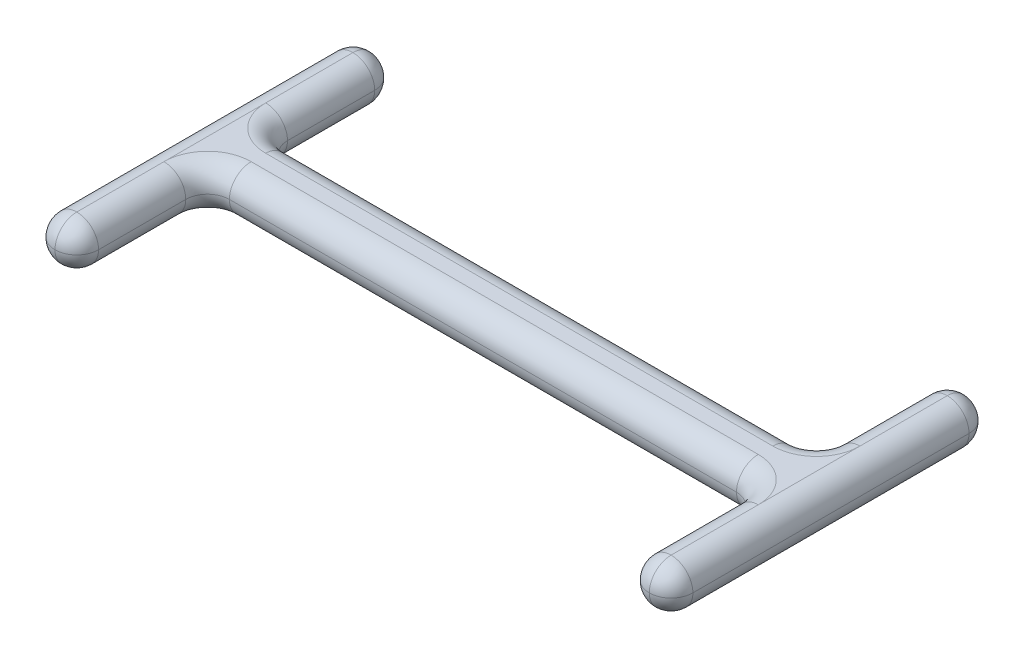
ISO-10303-21;
HEADER;
FILE_DESCRIPTION(('STEP AP214'),'2;1');
FILE_NAME('part.step','',(''),(''),'','','');
FILE_SCHEMA(('AUTOMOTIVE_DESIGN { 1 0 10303 214 1 1 1 1 }'));
ENDSEC;
DATA;
#1=APPLICATION_CONTEXT('core data for automotive mechanical design processes');
#2=APPLICATION_PROTOCOL_DEFINITION('international standard','automotive_design',2000,#1);
#3=PRODUCT_CONTEXT('',#1,'mechanical');
#4=PRODUCT('Part','Part','',(#3));
#5=PRODUCT_RELATED_PRODUCT_CATEGORY('part','',(#4));
#6=PRODUCT_DEFINITION_FORMATION('','',#4);
#7=PRODUCT_DEFINITION_CONTEXT('part definition',#1,'design');
#8=PRODUCT_DEFINITION('design','',#6,#7);
#9=PRODUCT_DEFINITION_SHAPE('','',#8);
#10=(LENGTH_UNIT() NAMED_UNIT(*) SI_UNIT(.MILLI.,.METRE.));
#11=(NAMED_UNIT(*) PLANE_ANGLE_UNIT() SI_UNIT($,.RADIAN.));
#12=(NAMED_UNIT(*) SI_UNIT($,.STERADIAN.) SOLID_ANGLE_UNIT());
#13=UNCERTAINTY_MEASURE_WITH_UNIT(LENGTH_MEASURE(1.E-05),#10,'distance_accuracy_value','');
#14=(GEOMETRIC_REPRESENTATION_CONTEXT(3) GLOBAL_UNCERTAINTY_ASSIGNED_CONTEXT((#13)) GLOBAL_UNIT_ASSIGNED_CONTEXT((#10,
#11,#12)) REPRESENTATION_CONTEXT('',''));
#15=CARTESIAN_POINT('',(0.,0.,0.));
#16=DIRECTION('',(0.,0.,1.));
#17=DIRECTION('',(1.,0.,0.));
#18=AXIS2_PLACEMENT_3D('',#15,#16,#17);
#19=CARTESIAN_POINT('',(0.,0.,0.));
#20=DIRECTION('',(0.,1.,0.));
#21=DIRECTION('',(0.,0.,1.));
#22=AXIS2_PLACEMENT_3D('',#19,#20,#21);
#23=PLANE('',#22);
#24=CARTESIAN_POINT('',(-43.615,0.,8.75000000000001));
#25=DIRECTION('',(0.,1.,0.));
#26=DIRECTION('',(0.,0.,1.));
#27=AXIS2_PLACEMENT_3D('',#24,#25,#26);
#28=CIRCLE('',#27,7.5);
#29=CARTESIAN_POINT('',(-51.115,0.,8.75000000000001));
#30=VERTEX_POINT('',#29);
#31=CARTESIAN_POINT('',(-43.615,0.,1.25000000000001));
#32=VERTEX_POINT('',#31);
#33=EDGE_CURVE('E214',#30,#32,#28,.F.);
#34=ORIENTED_EDGE('',*,*,#33,.F.);
#35=DIRECTION('',(0.,0.,1.));
#36=VECTOR('',#35,1.);
#37=CARTESIAN_POINT('',(-51.115,0.,0.));
#38=LINE('',#37,#36);
#39=CARTESIAN_POINT('',(-51.115,0.,-8.74999999999998));
#40=VERTEX_POINT('',#39);
#41=EDGE_CURVE('E360',#30,#40,#38,.F.);
#42=ORIENTED_EDGE('',*,*,#41,.T.);
#43=CARTESIAN_POINT('',(-43.615,0.,-8.74999999999998));
#44=DIRECTION('',(0.,1.,0.));
#45=DIRECTION('',(0.,0.,1.));
#46=AXIS2_PLACEMENT_3D('',#43,#44,#45);
#47=CIRCLE('',#46,7.5);
#48=CARTESIAN_POINT('',(-43.615,0.,-1.24999999999998));
#49=VERTEX_POINT('',#48);
#50=EDGE_CURVE('E364',#49,#40,#47,.F.);
#51=ORIENTED_EDGE('',*,*,#50,.F.);
#52=DIRECTION('',(-1.,0.,0.));
#53=VECTOR('',#52,1.);
#54=CARTESIAN_POINT('',(0.,0.,-1.24999999999999));
#55=LINE('',#54,#53);
#56=CARTESIAN_POINT('',(43.615,0.,-1.24999999999999));
#57=VERTEX_POINT('',#56);
#58=EDGE_CURVE('E372',#49,#57,#55,.F.);
#59=ORIENTED_EDGE('',*,*,#58,.T.);
#60=CARTESIAN_POINT('',(43.615,0.,-8.74999999999999));
#61=DIRECTION('',(0.,1.,0.));
#62=DIRECTION('',(0.,0.,1.));
#63=AXIS2_PLACEMENT_3D('',#60,#61,#62);
#64=CIRCLE('',#63,7.5);
#65=CARTESIAN_POINT('',(51.115,0.,-8.74999999999999));
#66=VERTEX_POINT('',#65);
#67=EDGE_CURVE('E376',#66,#57,#64,.F.);
#68=ORIENTED_EDGE('',*,*,#67,.F.);
#69=DIRECTION('',(0.,0.,-1.));
#70=VECTOR('',#69,1.);
#71=CARTESIAN_POINT('',(51.115,0.,0.));
#72=LINE('',#71,#70);
#73=CARTESIAN_POINT('',(51.115,0.,8.75000000000001));
#74=VERTEX_POINT('',#73);
#75=EDGE_CURVE('E384',#66,#74,#72,.F.);
#76=ORIENTED_EDGE('',*,*,#75,.T.);
#77=CARTESIAN_POINT('',(43.615,0.,8.75000000000001));
#78=DIRECTION('',(0.,1.,0.));
#79=DIRECTION('',(0.,0.,1.));
#80=AXIS2_PLACEMENT_3D('',#77,#78,#79);
#81=CIRCLE('',#80,7.5);
#82=CARTESIAN_POINT('',(43.615,0.,1.25000000000001));
#83=VERTEX_POINT('',#82);
#84=EDGE_CURVE('E380',#83,#74,#81,.F.);
#85=ORIENTED_EDGE('',*,*,#84,.F.);
#86=DIRECTION('',(1.,0.,0.));
#87=VECTOR('',#86,1.);
#88=CARTESIAN_POINT('',(0.,0.,1.25000000000001));
#89=LINE('',#88,#87);
#90=EDGE_CURVE('E368',#83,#32,#89,.F.);
#91=ORIENTED_EDGE('',*,*,#90,.T.);
#92=EDGE_LOOP('',(#34,#42,#51,#59,#68,#76,#85,#91));
#93=FACE_BOUND('',#92,.T.);
#94=ADVANCED_FACE('F43',(#93),#23,.F.);
#95=CARTESIAN_POINT('',(0.,7.5,0.));
#96=DIRECTION('',(0.,1.,0.));
#97=DIRECTION('',(0.,0.,1.));
#98=AXIS2_PLACEMENT_3D('',#95,#96,#97);
#99=PLANE('',#98);
#100=CARTESIAN_POINT('',(-43.615,7.5,-8.74999999999998));
#101=DIRECTION('',(0.,1.,0.));
#102=DIRECTION('',(0.,0.,1.));
#103=AXIS2_PLACEMENT_3D('',#100,#101,#102);
#104=CIRCLE('',#103,7.5);
#105=CARTESIAN_POINT('',(-51.115,7.5,-8.74999999999998));
#106=VERTEX_POINT('',#105);
#107=CARTESIAN_POINT('',(-43.615,7.5,-1.24999999999998));
#108=VERTEX_POINT('',#107);
#109=EDGE_CURVE('E392',#106,#108,#104,.T.);
#110=ORIENTED_EDGE('',*,*,#109,.F.);
#111=DIRECTION('',(0.,0.,1.));
#112=VECTOR('',#111,1.);
#113=CARTESIAN_POINT('',(-51.115,7.5,27.5));
#114=LINE('',#113,#112);
#115=CARTESIAN_POINT('',(-51.115,7.5,8.75000000000001));
#116=VERTEX_POINT('',#115);
#117=EDGE_CURVE('E388',#106,#116,#114,.T.);
#118=ORIENTED_EDGE('',*,*,#117,.T.);
#119=CARTESIAN_POINT('',(-43.615,7.5,8.75000000000001));
#120=DIRECTION('',(0.,1.,0.));
#121=DIRECTION('',(0.,0.,1.));
#122=AXIS2_PLACEMENT_3D('',#119,#120,#121);
#123=CIRCLE('',#122,7.5);
#124=CARTESIAN_POINT('',(-43.615,7.5,1.25000000000001));
#125=VERTEX_POINT('',#124);
#126=EDGE_CURVE('E396',#125,#116,#123,.T.);
#127=ORIENTED_EDGE('',*,*,#126,.F.);
#128=DIRECTION('',(1.,0.,0.));
#129=VECTOR('',#128,1.);
#130=CARTESIAN_POINT('',(47.365,7.5,1.25000000000001));
#131=LINE('',#130,#129);
#132=CARTESIAN_POINT('',(43.615,7.5,1.25000000000001));
#133=VERTEX_POINT('',#132);
#134=EDGE_CURVE('E400',#125,#133,#131,.T.);
#135=ORIENTED_EDGE('',*,*,#134,.T.);
#136=CARTESIAN_POINT('',(43.615,7.5,8.75000000000001));
#137=DIRECTION('',(0.,1.,0.));
#138=DIRECTION('',(0.,0.,1.));
#139=AXIS2_PLACEMENT_3D('',#136,#137,#138);
#140=CIRCLE('',#139,7.5);
#141=CARTESIAN_POINT('',(51.115,7.5,8.75000000000001));
#142=VERTEX_POINT('',#141);
#143=EDGE_CURVE('E404',#142,#133,#140,.T.);
#144=ORIENTED_EDGE('',*,*,#143,.F.);
#145=DIRECTION('',(0.,0.,-1.));
#146=VECTOR('',#145,1.);
#147=CARTESIAN_POINT('',(51.115,7.5,-27.5));
#148=LINE('',#147,#146);
#149=CARTESIAN_POINT('',(51.115,7.5,-8.74999999999999));
#150=VERTEX_POINT('',#149);
#151=EDGE_CURVE('E219',#142,#150,#148,.T.);
#152=ORIENTED_EDGE('',*,*,#151,.T.);
#153=CARTESIAN_POINT('',(43.615,7.5,-8.74999999999999));
#154=DIRECTION('',(0.,1.,0.));
#155=DIRECTION('',(0.,0.,1.));
#156=AXIS2_PLACEMENT_3D('',#153,#154,#155);
#157=CIRCLE('',#156,7.5);
#158=CARTESIAN_POINT('',(43.615,7.5,-1.24999999999999));
#159=VERTEX_POINT('',#158);
#160=EDGE_CURVE('E412',#159,#150,#157,.T.);
#161=ORIENTED_EDGE('',*,*,#160,.F.);
#162=DIRECTION('',(-1.,0.,0.));
#163=VECTOR('',#162,1.);
#164=CARTESIAN_POINT('',(-47.365,7.5,-1.24999999999998));
#165=LINE('',#164,#163);
#166=EDGE_CURVE('E408',#159,#108,#165,.T.);
#167=ORIENTED_EDGE('',*,*,#166,.T.);
#168=EDGE_LOOP('',(#110,#118,#127,#135,#144,#152,#161,#167));
#169=FACE_BOUND('',#168,.T.);
#170=ADVANCED_FACE('F424',(#169),#99,.T.);
#171=CARTESIAN_POINT('',(-47.365,3.75,-1.24999999999998));
#172=DIRECTION('',(-1.,0.,0.));
#173=DIRECTION('',(0.,0.,1.));
#174=AXIS2_PLACEMENT_3D('',#171,#172,#173);
#175=CYLINDRICAL_SURFACE('',#174,3.75);
#176=CARTESIAN_POINT('',(43.615,3.75,-1.24999999999999));
#177=DIRECTION('',(1.,0.,0.));
#178=DIRECTION('',(0.,0.,-1.));
#179=AXIS2_PLACEMENT_3D('',#176,#177,#178);
#180=CIRCLE('',#179,3.75);
#181=CARTESIAN_POINT('',(43.615,3.75,-4.99999999999999));
#182=VERTEX_POINT('',#181);
#183=EDGE_CURVE('E228',#57,#182,#180,.T.);
#184=ORIENTED_EDGE('',*,*,#183,.F.);
#185=ORIENTED_EDGE('',*,*,#58,.F.);
#186=CARTESIAN_POINT('',(-43.615,3.75,-1.24999999999998));
#187=DIRECTION('',(-1.,0.,0.));
#188=DIRECTION('',(0.,0.,1.));
#189=AXIS2_PLACEMENT_3D('',#186,#187,#188);
#190=CIRCLE('',#189,3.75);
#191=CARTESIAN_POINT('',(-43.615,3.75,-4.99999999999998));
#192=VERTEX_POINT('',#191);
#193=EDGE_CURVE('E215',#192,#49,#190,.T.);
#194=ORIENTED_EDGE('',*,*,#193,.F.);
#195=DIRECTION('',(-1.,0.,0.));
#196=VECTOR('',#195,1.);
#197=CARTESIAN_POINT('',(-47.365,3.75,-4.99999999999998));
#198=LINE('',#197,#196);
#199=EDGE_CURVE('E224',#182,#192,#198,.T.);
#200=ORIENTED_EDGE('',*,*,#199,.F.);
#201=EDGE_LOOP('',(#184,#185,#194,#200));
#202=FACE_BOUND('',#201,.T.);
#203=ADVANCED_FACE('F591',(#202),#175,.T.);
#204=CARTESIAN_POINT('',(-43.615,3.75,-8.74999999999998));
#205=DIRECTION('',(0.,1.,0.));
#206=DIRECTION('',(0.,0.,1.));
#207=AXIS2_PLACEMENT_3D('',#204,#205,#206);
#208=TOROIDAL_SURFACE('',#207,7.5,3.75);
#209=CARTESIAN_POINT('',(-43.615,3.75,-8.74999999999998));
#210=DIRECTION('',(0.,1.,0.));
#211=DIRECTION('',(0.,0.,1.));
#212=AXIS2_PLACEMENT_3D('',#209,#210,#211);
#213=CIRCLE('',#212,3.75);
#214=CARTESIAN_POINT('',(-47.365,3.75,-8.74999999999998));
#215=VERTEX_POINT('',#214);
#216=EDGE_CURVE('E220',#192,#215,#213,.F.);
#217=ORIENTED_EDGE('',*,*,#216,.F.);
#218=ORIENTED_EDGE('',*,*,#193,.T.);
#219=ORIENTED_EDGE('',*,*,#50,.T.);
#220=CARTESIAN_POINT('',(-51.115,3.75,-8.74999999999998));
#221=DIRECTION('',(0.,0.,1.));
#222=DIRECTION('',(1.,0.,0.));
#223=AXIS2_PLACEMENT_3D('',#220,#221,#222);
#224=CIRCLE('',#223,3.75);
#225=EDGE_CURVE('E232',#215,#40,#224,.F.);
#226=ORIENTED_EDGE('',*,*,#225,.F.);
#227=EDGE_LOOP('',(#217,#218,#219,#226));
#228=FACE_BOUND('',#227,.T.);
#229=ADVANCED_FACE('F596',(#228),#208,.T.);
#230=CARTESIAN_POINT('',(0.,3.75,-1.24999999999999));
#231=DIRECTION('',(1.,0.,0.));
#232=DIRECTION('',(0.,0.,-1.));
#233=AXIS2_PLACEMENT_3D('',#230,#231,#232);
#234=CYLINDRICAL_SURFACE('',#233,3.75);
#235=CARTESIAN_POINT('',(43.615,3.75,-1.24999999999999));
#236=DIRECTION('',(1.,0.,0.));
#237=DIRECTION('',(0.,0.,-1.));
#238=AXIS2_PLACEMENT_3D('',#235,#236,#237);
#239=CIRCLE('',#238,3.75);
#240=EDGE_CURVE('E240',#182,#159,#239,.T.);
#241=ORIENTED_EDGE('',*,*,#240,.F.);
#242=ORIENTED_EDGE('',*,*,#199,.T.);
#243=CARTESIAN_POINT('',(-43.615,3.75,-1.24999999999998));
#244=DIRECTION('',(-1.,0.,0.));
#245=DIRECTION('',(0.,0.,1.));
#246=AXIS2_PLACEMENT_3D('',#243,#244,#245);
#247=CIRCLE('',#246,3.75);
#248=EDGE_CURVE('E236',#108,#192,#247,.T.);
#249=ORIENTED_EDGE('',*,*,#248,.F.);
#250=ORIENTED_EDGE('',*,*,#166,.F.);
#251=EDGE_LOOP('',(#241,#242,#249,#250));
#252=FACE_BOUND('',#251,.T.);
#253=ADVANCED_FACE('F588',(#252),#234,.T.);
#254=CARTESIAN_POINT('',(43.615,3.75,-8.74999999999999));
#255=DIRECTION('',(0.,1.,0.));
#256=DIRECTION('',(0.,0.,1.));
#257=AXIS2_PLACEMENT_3D('',#254,#255,#256);
#258=TOROIDAL_SURFACE('',#257,7.5,3.75);
#259=ORIENTED_EDGE('',*,*,#183,.T.);
#260=CARTESIAN_POINT('',(43.615,3.75,-8.74999999999999));
#261=DIRECTION('',(0.,1.,0.));
#262=DIRECTION('',(0.,0.,1.));
#263=AXIS2_PLACEMENT_3D('',#260,#261,#262);
#264=CIRCLE('',#263,3.75);
#265=CARTESIAN_POINT('',(47.365,3.75,-8.74999999999999));
#266=VERTEX_POINT('',#265);
#267=EDGE_CURVE('E244',#266,#182,#264,.F.);
#268=ORIENTED_EDGE('',*,*,#267,.F.);
#269=CARTESIAN_POINT('',(51.115,3.75,-8.74999999999999));
#270=DIRECTION('',(0.,0.,1.));
#271=DIRECTION('',(1.,0.,0.));
#272=AXIS2_PLACEMENT_3D('',#269,#270,#271);
#273=CIRCLE('',#272,3.75);
#274=EDGE_CURVE('E248',#66,#266,#273,.F.);
#275=ORIENTED_EDGE('',*,*,#274,.F.);
#276=ORIENTED_EDGE('',*,*,#67,.T.);
#277=EDGE_LOOP('',(#259,#268,#275,#276));
#278=FACE_BOUND('',#277,.T.);
#279=ADVANCED_FACE('F594',(#278),#258,.T.);
#280=CARTESIAN_POINT('',(-51.115,3.75,-27.5));
#281=DIRECTION('',(0.,0.,-1.));
#282=DIRECTION('',(-1.,0.,0.));
#283=AXIS2_PLACEMENT_3D('',#280,#281,#282);
#284=CYLINDRICAL_SURFACE('',#283,3.75);
#285=DIRECTION('',(0.,0.,-1.));
#286=VECTOR('',#285,1.);
#287=CARTESIAN_POINT('',(-51.115,0.,0.));
#288=LINE('',#287,#286);
#289=CARTESIAN_POINT('',(-51.115,0.,-23.75));
#290=VERTEX_POINT('',#289);
#291=EDGE_CURVE('E252',#290,#40,#288,.F.);
#292=ORIENTED_EDGE('',*,*,#291,.F.);
#293=CARTESIAN_POINT('',(-51.115,3.75,-23.75));
#294=DIRECTION('',(0.,0.,-1.));
#295=DIRECTION('',(-1.,0.,0.));
#296=AXIS2_PLACEMENT_3D('',#293,#294,#295);
#297=CIRCLE('',#296,3.75);
#298=CARTESIAN_POINT('',(-47.365,3.75,-23.75));
#299=VERTEX_POINT('',#298);
#300=EDGE_CURVE('E206',#290,#299,#297,.F.);
#301=ORIENTED_EDGE('',*,*,#300,.T.);
#302=DIRECTION('',(0.,0.,-1.));
#303=VECTOR('',#302,1.);
#304=CARTESIAN_POINT('',(-47.365,3.75,-27.5));
#305=LINE('',#304,#303);
#306=EDGE_CURVE('E256',#215,#299,#305,.T.);
#307=ORIENTED_EDGE('',*,*,#306,.F.);
#308=ORIENTED_EDGE('',*,*,#225,.T.);
#309=EDGE_LOOP('',(#292,#301,#307,#308));
#310=FACE_BOUND('',#309,.T.);
#311=ADVANCED_FACE('F566',(#310),#284,.T.);
#312=CARTESIAN_POINT('',(-43.615,3.75,-8.74999999999998));
#313=DIRECTION('',(0.,1.,0.));
#314=DIRECTION('',(0.,0.,1.));
#315=AXIS2_PLACEMENT_3D('',#312,#313,#314);
#316=TOROIDAL_SURFACE('',#315,7.5,3.75);
#317=ORIENTED_EDGE('',*,*,#248,.T.);
#318=ORIENTED_EDGE('',*,*,#216,.T.);
#319=CARTESIAN_POINT('',(-51.115,3.75,-8.74999999999998));
#320=DIRECTION('',(0.,0.,1.));
#321=DIRECTION('',(1.,0.,0.));
#322=AXIS2_PLACEMENT_3D('',#319,#320,#321);
#323=CIRCLE('',#322,3.75);
#324=EDGE_CURVE('E260',#106,#215,#323,.F.);
#325=ORIENTED_EDGE('',*,*,#324,.F.);
#326=ORIENTED_EDGE('',*,*,#109,.T.);
#327=EDGE_LOOP('',(#317,#318,#325,#326));
#328=FACE_BOUND('',#327,.T.);
#329=ADVANCED_FACE('F572',(#328),#316,.T.);
#330=CARTESIAN_POINT('',(43.615,3.75,-8.74999999999999));
#331=DIRECTION('',(0.,1.,0.));
#332=DIRECTION('',(0.,0.,1.));
#333=AXIS2_PLACEMENT_3D('',#330,#331,#332);
#334=TOROIDAL_SURFACE('',#333,7.5,3.75);
#335=ORIENTED_EDGE('',*,*,#240,.T.);
#336=ORIENTED_EDGE('',*,*,#160,.T.);
#337=CARTESIAN_POINT('',(51.115,3.75,-8.74999999999999));
#338=DIRECTION('',(0.,0.,1.));
#339=DIRECTION('',(1.,0.,0.));
#340=AXIS2_PLACEMENT_3D('',#337,#338,#339);
#341=CIRCLE('',#340,3.75);
#342=EDGE_CURVE('E264',#266,#150,#341,.F.);
#343=ORIENTED_EDGE('',*,*,#342,.F.);
#344=ORIENTED_EDGE('',*,*,#267,.T.);
#345=EDGE_LOOP('',(#335,#336,#343,#344));
#346=FACE_BOUND('',#345,.T.);
#347=ADVANCED_FACE('F432',(#346),#334,.T.);
#348=CARTESIAN_POINT('',(51.115,3.75,-27.5));
#349=DIRECTION('',(0.,0.,1.));
#350=DIRECTION('',(1.,0.,0.));
#351=AXIS2_PLACEMENT_3D('',#348,#349,#350);
#352=CYLINDRICAL_SURFACE('',#351,3.75);
#353=DIRECTION('',(0.,0.,1.));
#354=VECTOR('',#353,1.);
#355=CARTESIAN_POINT('',(47.365,3.75,-27.5));
#356=LINE('',#355,#354);
#357=CARTESIAN_POINT('',(47.365,3.75,-23.75));
#358=VERTEX_POINT('',#357);
#359=EDGE_CURVE('E268',#358,#266,#356,.T.);
#360=ORIENTED_EDGE('',*,*,#359,.F.);
#361=CARTESIAN_POINT('',(51.115,3.75,-23.75));
#362=DIRECTION('',(0.,0.,1.));
#363=DIRECTION('',(1.,0.,0.));
#364=AXIS2_PLACEMENT_3D('',#361,#362,#363);
#365=CIRCLE('',#364,3.75);
#366=CARTESIAN_POINT('',(51.115,0.,-23.75));
#367=VERTEX_POINT('',#366);
#368=EDGE_CURVE('E54',#358,#367,#365,.T.);
#369=ORIENTED_EDGE('',*,*,#368,.T.);
#370=DIRECTION('',(0.,0.,1.));
#371=VECTOR('',#370,1.);
#372=CARTESIAN_POINT('',(51.115,0.,0.));
#373=LINE('',#372,#371);
#374=EDGE_CURVE('E272',#66,#367,#373,.F.);
#375=ORIENTED_EDGE('',*,*,#374,.F.);
#376=ORIENTED_EDGE('',*,*,#274,.T.);
#377=EDGE_LOOP('',(#360,#369,#375,#376));
#378=FACE_BOUND('',#377,.T.);
#379=ADVANCED_FACE('F442',(#378),#352,.T.);
#380=CARTESIAN_POINT('',(-51.115,3.75,-27.5));
#381=DIRECTION('',(0.,0.,1.));
#382=DIRECTION('',(1.,0.,0.));
#383=AXIS2_PLACEMENT_3D('',#380,#381,#382);
#384=CYLINDRICAL_SURFACE('',#383,3.75);
#385=DIRECTION('',(0.,0.,1.));
#386=VECTOR('',#385,1.);
#387=CARTESIAN_POINT('',(-51.115,0.,0.));
#388=LINE('',#387,#386);
#389=CARTESIAN_POINT('',(-51.115,0.,23.75));
#390=VERTEX_POINT('',#389);
#391=EDGE_CURVE('E276',#390,#30,#388,.F.);
#392=ORIENTED_EDGE('',*,*,#391,.F.);
#393=CARTESIAN_POINT('',(-51.115,3.75,23.75));
#394=DIRECTION('',(0.,0.,1.));
#395=DIRECTION('',(1.,0.,0.));
#396=AXIS2_PLACEMENT_3D('',#393,#394,#395);
#397=CIRCLE('',#396,3.75);
#398=CARTESIAN_POINT('',(-54.865,3.75,23.75));
#399=VERTEX_POINT('',#398);
#400=EDGE_CURVE('E190',#390,#399,#397,.F.);
#401=ORIENTED_EDGE('',*,*,#400,.T.);
#402=DIRECTION('',(0.,0.,1.));
#403=VECTOR('',#402,1.);
#404=CARTESIAN_POINT('',(-54.865,3.75,-27.5));
#405=LINE('',#404,#403);
#406=CARTESIAN_POINT('',(-54.865,3.75,-23.75));
#407=VERTEX_POINT('',#406);
#408=EDGE_CURVE('E280',#407,#399,#405,.T.);
#409=ORIENTED_EDGE('',*,*,#408,.F.);
#410=CARTESIAN_POINT('',(-51.115,3.75,-23.75));
#411=DIRECTION('',(0.,0.,1.));
#412=DIRECTION('',(1.,0.,0.));
#413=AXIS2_PLACEMENT_3D('',#410,#411,#412);
#414=CIRCLE('',#413,3.75);
#415=EDGE_CURVE('E194',#407,#290,#414,.T.);
#416=ORIENTED_EDGE('',*,*,#415,.T.);
#417=ORIENTED_EDGE('',*,*,#291,.T.);
#418=ORIENTED_EDGE('',*,*,#41,.F.);
#419=EDGE_LOOP('',(#392,#401,#409,#416,#417,#418));
#420=FACE_BOUND('',#419,.T.);
#421=ADVANCED_FACE('F549',(#420),#384,.T.);
#422=CARTESIAN_POINT('',(-51.115,3.75,0.));
#423=DIRECTION('',(0.,0.,1.));
#424=DIRECTION('',(1.,0.,0.));
#425=AXIS2_PLACEMENT_3D('',#422,#423,#424);
#426=CYLINDRICAL_SURFACE('',#425,3.75);
#427=ORIENTED_EDGE('',*,*,#306,.T.);
#428=CARTESIAN_POINT('',(-51.115,3.75,-23.75));
#429=DIRECTION('',(0.,0.,1.));
#430=DIRECTION('',(1.,0.,0.));
#431=AXIS2_PLACEMENT_3D('',#428,#429,#430);
#432=CIRCLE('',#431,3.75);
#433=CARTESIAN_POINT('',(-51.115,7.5,-23.75));
#434=VERTEX_POINT('',#433);
#435=EDGE_CURVE('E210',#299,#434,#432,.T.);
#436=ORIENTED_EDGE('',*,*,#435,.T.);
#437=DIRECTION('',(0.,0.,-1.));
#438=VECTOR('',#437,1.);
#439=CARTESIAN_POINT('',(-51.115,7.5,-27.5));
#440=LINE('',#439,#438);
#441=EDGE_CURVE('E284',#106,#434,#440,.T.);
#442=ORIENTED_EDGE('',*,*,#441,.F.);
#443=ORIENTED_EDGE('',*,*,#324,.T.);
#444=EDGE_LOOP('',(#427,#436,#442,#443));
#445=FACE_BOUND('',#444,.T.);
#446=ADVANCED_FACE('F568',(#445),#426,.T.);
#447=CARTESIAN_POINT('',(51.115,3.75,0.));
#448=DIRECTION('',(0.,0.,-1.));
#449=DIRECTION('',(-1.,0.,0.));
#450=AXIS2_PLACEMENT_3D('',#447,#448,#449);
#451=CYLINDRICAL_SURFACE('',#450,3.75);
#452=DIRECTION('',(0.,0.,1.));
#453=VECTOR('',#452,1.);
#454=CARTESIAN_POINT('',(51.115,7.5,-4.99999999999999));
#455=LINE('',#454,#453);
#456=CARTESIAN_POINT('',(51.115,7.5,-23.75));
#457=VERTEX_POINT('',#456);
#458=EDGE_CURVE('E288',#457,#150,#455,.T.);
#459=ORIENTED_EDGE('',*,*,#458,.F.);
#460=CARTESIAN_POINT('',(51.115,3.75,-23.75));
#461=DIRECTION('',(0.,0.,-1.));
#462=DIRECTION('',(-1.,0.,0.));
#463=AXIS2_PLACEMENT_3D('',#460,#461,#462);
#464=CIRCLE('',#463,3.75);
#465=EDGE_CURVE('E11',#457,#358,#464,.F.);
#466=ORIENTED_EDGE('',*,*,#465,.T.);
#467=ORIENTED_EDGE('',*,*,#359,.T.);
#468=ORIENTED_EDGE('',*,*,#342,.T.);
#469=EDGE_LOOP('',(#459,#466,#467,#468));
#470=FACE_BOUND('',#469,.T.);
#471=ADVANCED_FACE('F436',(#470),#451,.T.);
#472=CARTESIAN_POINT('',(51.115,3.75,-27.5));
#473=DIRECTION('',(0.,0.,-1.));
#474=DIRECTION('',(-1.,0.,0.));
#475=AXIS2_PLACEMENT_3D('',#472,#473,#474);
#476=CYLINDRICAL_SURFACE('',#475,3.75);
#477=ORIENTED_EDGE('',*,*,#374,.T.);
#478=CARTESIAN_POINT('',(51.115,3.75,-23.75));
#479=DIRECTION('',(0.,0.,-1.));
#480=DIRECTION('',(-1.,0.,0.));
#481=AXIS2_PLACEMENT_3D('',#478,#479,#480);
#482=CIRCLE('',#481,3.75);
#483=CARTESIAN_POINT('',(54.865,3.75,-23.75));
#484=VERTEX_POINT('',#483);
#485=EDGE_CURVE('E113',#367,#484,#482,.F.);
#486=ORIENTED_EDGE('',*,*,#485,.T.);
#487=DIRECTION('',(0.,0.,-1.));
#488=VECTOR('',#487,1.);
#489=CARTESIAN_POINT('',(54.865,3.75,-27.5));
#490=LINE('',#489,#488);
#491=CARTESIAN_POINT('',(54.865,3.75,23.75));
#492=VERTEX_POINT('',#491);
#493=EDGE_CURVE('E291',#492,#484,#490,.T.);
#494=ORIENTED_EDGE('',*,*,#493,.F.);
#495=CARTESIAN_POINT('',(51.115,3.75,23.75));
#496=DIRECTION('',(0.,0.,-1.));
#497=DIRECTION('',(-1.,0.,0.));
#498=AXIS2_PLACEMENT_3D('',#495,#496,#497);
#499=CIRCLE('',#498,3.75);
#500=CARTESIAN_POINT('',(51.115,0.,23.75));
#501=VERTEX_POINT('',#500);
#502=EDGE_CURVE('E178',#492,#501,#499,.T.);
#503=ORIENTED_EDGE('',*,*,#502,.T.);
#504=DIRECTION('',(0.,0.,-1.));
#505=VECTOR('',#504,1.);
#506=CARTESIAN_POINT('',(51.115,0.,0.));
#507=LINE('',#506,#505);
#508=EDGE_CURVE('E294',#74,#501,#507,.F.);
#509=ORIENTED_EDGE('',*,*,#508,.F.);
#510=ORIENTED_EDGE('',*,*,#75,.F.);
#511=EDGE_LOOP('',(#477,#486,#494,#503,#509,#510));
#512=FACE_BOUND('',#511,.T.);
#513=ADVANCED_FACE('F495',(#512),#476,.T.);
#514=CARTESIAN_POINT('',(-51.115,3.75,27.5));
#515=DIRECTION('',(0.,0.,-1.));
#516=DIRECTION('',(-1.,0.,0.));
#517=AXIS2_PLACEMENT_3D('',#514,#515,#516);
#518=CYLINDRICAL_SURFACE('',#517,3.75);
#519=DIRECTION('',(0.,0.,-1.));
#520=VECTOR('',#519,1.);
#521=CARTESIAN_POINT('',(-47.365,3.75,27.5));
#522=LINE('',#521,#520);
#523=CARTESIAN_POINT('',(-47.365,3.75,23.75));
#524=VERTEX_POINT('',#523);
#525=CARTESIAN_POINT('',(-47.365,3.75,8.75000000000001));
#526=VERTEX_POINT('',#525);
#527=EDGE_CURVE('E310',#524,#526,#522,.T.);
#528=ORIENTED_EDGE('',*,*,#527,.F.);
#529=CARTESIAN_POINT('',(-51.115,3.75,23.75));
#530=DIRECTION('',(0.,0.,-1.));
#531=DIRECTION('',(-1.,0.,0.));
#532=AXIS2_PLACEMENT_3D('',#529,#530,#531);
#533=CIRCLE('',#532,3.75);
#534=EDGE_CURVE('E162',#524,#390,#533,.T.);
#535=ORIENTED_EDGE('',*,*,#534,.T.);
#536=ORIENTED_EDGE('',*,*,#391,.T.);
#537=CARTESIAN_POINT('',(-51.115,3.75,8.75000000000001));
#538=DIRECTION('',(0.,0.,-1.));
#539=DIRECTION('',(-1.,0.,0.));
#540=AXIS2_PLACEMENT_3D('',#537,#538,#539);
#541=CIRCLE('',#540,3.75);
#542=EDGE_CURVE('E302',#526,#30,#541,.T.);
#543=ORIENTED_EDGE('',*,*,#542,.F.);
#544=EDGE_LOOP('',(#528,#535,#536,#543));
#545=FACE_BOUND('',#544,.T.);
#546=ADVANCED_FACE('F646',(#545),#518,.T.);
#547=CARTESIAN_POINT('',(-51.115,3.75,0.));
#548=DIRECTION('',(0.,0.,-1.));
#549=DIRECTION('',(-1.,0.,0.));
#550=AXIS2_PLACEMENT_3D('',#547,#548,#549);
#551=CYLINDRICAL_SURFACE('',#550,3.75);
#552=ORIENTED_EDGE('',*,*,#408,.T.);
#553=CARTESIAN_POINT('',(-51.115,3.75,23.75));
#554=DIRECTION('',(0.,0.,-1.));
#555=DIRECTION('',(-1.,0.,0.));
#556=AXIS2_PLACEMENT_3D('',#553,#554,#555);
#557=CIRCLE('',#556,3.75);
#558=CARTESIAN_POINT('',(-51.115,7.5,23.75));
#559=VERTEX_POINT('',#558);
#560=EDGE_CURVE('E198',#399,#559,#557,.T.);
#561=ORIENTED_EDGE('',*,*,#560,.T.);
#562=DIRECTION('',(0.,0.,1.));
#563=VECTOR('',#562,1.);
#564=CARTESIAN_POINT('',(-51.115,7.5,27.5));
#565=LINE('',#564,#563);
#566=EDGE_CURVE('E314',#116,#559,#565,.T.);
#567=ORIENTED_EDGE('',*,*,#566,.F.);
#568=ORIENTED_EDGE('',*,*,#117,.F.);
#569=ORIENTED_EDGE('',*,*,#441,.T.);
#570=CARTESIAN_POINT('',(-51.115,3.75,-23.75));
#571=DIRECTION('',(0.,0.,-1.));
#572=DIRECTION('',(-1.,0.,0.));
#573=AXIS2_PLACEMENT_3D('',#570,#571,#572);
#574=CIRCLE('',#573,3.75);
#575=EDGE_CURVE('E202',#434,#407,#574,.F.);
#576=ORIENTED_EDGE('',*,*,#575,.T.);
#577=EDGE_LOOP('',(#552,#561,#567,#568,#569,#576));
#578=FACE_BOUND('',#577,.T.);
#579=ADVANCED_FACE('F540',(#578),#551,.T.);
#580=CARTESIAN_POINT('',(51.115,3.75,0.));
#581=DIRECTION('',(0.,0.,1.));
#582=DIRECTION('',(1.,0.,0.));
#583=AXIS2_PLACEMENT_3D('',#580,#581,#582);
#584=CYLINDRICAL_SURFACE('',#583,3.75);
#585=ORIENTED_EDGE('',*,*,#493,.T.);
#586=CARTESIAN_POINT('',(51.115,3.75,-23.75));
#587=DIRECTION('',(0.,0.,1.));
#588=DIRECTION('',(1.,0.,0.));
#589=AXIS2_PLACEMENT_3D('',#586,#587,#588);
#590=CIRCLE('',#589,3.75);
#591=EDGE_CURVE('E63',#484,#457,#590,.T.);
#592=ORIENTED_EDGE('',*,*,#591,.T.);
#593=ORIENTED_EDGE('',*,*,#458,.T.);
#594=ORIENTED_EDGE('',*,*,#151,.F.);
#595=DIRECTION('',(0.,0.,-1.));
#596=VECTOR('',#595,1.);
#597=CARTESIAN_POINT('',(51.115,7.5,-27.5));
#598=LINE('',#597,#596);
#599=CARTESIAN_POINT('',(51.115,7.5,23.75));
#600=VERTEX_POINT('',#599);
#601=EDGE_CURVE('E318',#600,#142,#598,.T.);
#602=ORIENTED_EDGE('',*,*,#601,.F.);
#603=CARTESIAN_POINT('',(51.115,3.75,23.75));
#604=DIRECTION('',(0.,0.,1.));
#605=DIRECTION('',(1.,0.,0.));
#606=AXIS2_PLACEMENT_3D('',#603,#604,#605);
#607=CIRCLE('',#606,3.75);
#608=EDGE_CURVE('E172',#600,#492,#607,.F.);
#609=ORIENTED_EDGE('',*,*,#608,.T.);
#610=EDGE_LOOP('',(#585,#592,#593,#594,#602,#609));
#611=FACE_BOUND('',#610,.T.);
#612=ADVANCED_FACE('F479',(#611),#584,.T.);
#613=CARTESIAN_POINT('',(51.115,3.75,27.5));
#614=DIRECTION('',(0.,0.,1.));
#615=DIRECTION('',(1.,0.,0.));
#616=AXIS2_PLACEMENT_3D('',#613,#614,#615);
#617=CYLINDRICAL_SURFACE('',#616,3.75);
#618=ORIENTED_EDGE('',*,*,#508,.T.);
#619=CARTESIAN_POINT('',(51.115,3.75,23.75));
#620=DIRECTION('',(0.,0.,1.));
#621=DIRECTION('',(1.,0.,0.));
#622=AXIS2_PLACEMENT_3D('',#619,#620,#621);
#623=CIRCLE('',#622,3.75);
#624=CARTESIAN_POINT('',(47.365,3.75,23.75));
#625=VERTEX_POINT('',#624);
#626=EDGE_CURVE('E186',#501,#625,#623,.F.);
#627=ORIENTED_EDGE('',*,*,#626,.T.);
#628=DIRECTION('',(0.,0.,1.));
#629=VECTOR('',#628,1.);
#630=CARTESIAN_POINT('',(47.365,3.75,27.5));
#631=LINE('',#630,#629);
#632=CARTESIAN_POINT('',(47.365,3.75,8.75000000000001));
#633=VERTEX_POINT('',#632);
#634=EDGE_CURVE('E322',#633,#625,#631,.T.);
#635=ORIENTED_EDGE('',*,*,#634,.F.);
#636=CARTESIAN_POINT('',(51.115,3.75,8.75000000000001));
#637=DIRECTION('',(0.,0.,-1.));
#638=DIRECTION('',(-1.,0.,0.));
#639=AXIS2_PLACEMENT_3D('',#636,#637,#638);
#640=CIRCLE('',#639,3.75);
#641=EDGE_CURVE('E298',#74,#633,#640,.T.);
#642=ORIENTED_EDGE('',*,*,#641,.F.);
#643=EDGE_LOOP('',(#618,#627,#635,#642));
#644=FACE_BOUND('',#643,.T.);
#645=ADVANCED_FACE('F500',(#644),#617,.T.);
#646=CARTESIAN_POINT('',(43.615,3.75,8.75000000000001));
#647=DIRECTION('',(0.,1.,0.));
#648=DIRECTION('',(0.,0.,1.));
#649=AXIS2_PLACEMENT_3D('',#646,#647,#648);
#650=TOROIDAL_SURFACE('',#649,7.5,3.75);
#651=ORIENTED_EDGE('',*,*,#84,.T.);
#652=ORIENTED_EDGE('',*,*,#641,.T.);
#653=CARTESIAN_POINT('',(43.615,3.75,8.75000000000001));
#654=DIRECTION('',(0.,1.,0.));
#655=DIRECTION('',(0.,0.,1.));
#656=AXIS2_PLACEMENT_3D('',#653,#654,#655);
#657=CIRCLE('',#656,3.75);
#658=CARTESIAN_POINT('',(43.615,3.75,5.00000000000001));
#659=VERTEX_POINT('',#658);
#660=EDGE_CURVE('E326',#659,#633,#657,.F.);
#661=ORIENTED_EDGE('',*,*,#660,.F.);
#662=CARTESIAN_POINT('',(43.615,3.75,1.25000000000001));
#663=DIRECTION('',(1.,0.,0.));
#664=DIRECTION('',(0.,0.,-1.));
#665=AXIS2_PLACEMENT_3D('',#662,#663,#664);
#666=CIRCLE('',#665,3.75);
#667=EDGE_CURVE('E330',#83,#659,#666,.F.);
#668=ORIENTED_EDGE('',*,*,#667,.F.);
#669=EDGE_LOOP('',(#651,#652,#661,#668));
#670=FACE_BOUND('',#669,.T.);
#671=ADVANCED_FACE('F509',(#670),#650,.T.);
#672=CARTESIAN_POINT('',(-43.615,3.75,8.75000000000001));
#673=DIRECTION('',(0.,1.,0.));
#674=DIRECTION('',(0.,0.,1.));
#675=AXIS2_PLACEMENT_3D('',#672,#673,#674);
#676=TOROIDAL_SURFACE('',#675,7.5,3.75);
#677=CARTESIAN_POINT('',(-43.615,3.75,8.75000000000001));
#678=DIRECTION('',(0.,1.,0.));
#679=DIRECTION('',(0.,0.,1.));
#680=AXIS2_PLACEMENT_3D('',#677,#678,#679);
#681=CIRCLE('',#680,3.75);
#682=CARTESIAN_POINT('',(-43.615,3.75,5.00000000000001));
#683=VERTEX_POINT('',#682);
#684=EDGE_CURVE('E306',#526,#683,#681,.F.);
#685=ORIENTED_EDGE('',*,*,#684,.F.);
#686=ORIENTED_EDGE('',*,*,#542,.T.);
#687=ORIENTED_EDGE('',*,*,#33,.T.);
#688=CARTESIAN_POINT('',(-43.615,3.75,1.25000000000001));
#689=DIRECTION('',(-1.,0.,0.));
#690=DIRECTION('',(0.,0.,1.));
#691=AXIS2_PLACEMENT_3D('',#688,#689,#690);
#692=CIRCLE('',#691,3.75);
#693=EDGE_CURVE('E334',#683,#32,#692,.F.);
#694=ORIENTED_EDGE('',*,*,#693,.F.);
#695=EDGE_LOOP('',(#685,#686,#687,#694));
#696=FACE_BOUND('',#695,.T.);
#697=ADVANCED_FACE('F633',(#696),#676,.T.);
#698=CARTESIAN_POINT('',(-51.115,3.75,0.));
#699=DIRECTION('',(0.,0.,1.));
#700=DIRECTION('',(1.,0.,0.));
#701=AXIS2_PLACEMENT_3D('',#698,#699,#700);
#702=CYLINDRICAL_SURFACE('',#701,3.75);
#703=ORIENTED_EDGE('',*,*,#566,.T.);
#704=CARTESIAN_POINT('',(-51.115,3.75,23.75));
#705=DIRECTION('',(0.,0.,1.));
#706=DIRECTION('',(1.,0.,0.));
#707=AXIS2_PLACEMENT_3D('',#704,#705,#706);
#708=CIRCLE('',#707,3.75);
#709=EDGE_CURVE('E166',#559,#524,#708,.F.);
#710=ORIENTED_EDGE('',*,*,#709,.T.);
#711=ORIENTED_EDGE('',*,*,#527,.T.);
#712=CARTESIAN_POINT('',(-51.115,3.75,8.75000000000001));
#713=DIRECTION('',(0.,0.,-1.));
#714=DIRECTION('',(-1.,0.,0.));
#715=AXIS2_PLACEMENT_3D('',#712,#713,#714);
#716=CIRCLE('',#715,3.75);
#717=EDGE_CURVE('E338',#116,#526,#716,.T.);
#718=ORIENTED_EDGE('',*,*,#717,.F.);
#719=EDGE_LOOP('',(#703,#710,#711,#718));
#720=FACE_BOUND('',#719,.T.);
#721=ADVANCED_FACE('F630',(#720),#702,.T.);
#722=CARTESIAN_POINT('',(51.115,3.75,0.));
#723=DIRECTION('',(0.,0.,-1.));
#724=DIRECTION('',(-1.,0.,0.));
#725=AXIS2_PLACEMENT_3D('',#722,#723,#724);
#726=CYLINDRICAL_SURFACE('',#725,3.75);
#727=ORIENTED_EDGE('',*,*,#634,.T.);
#728=CARTESIAN_POINT('',(51.115,3.75,23.75));
#729=DIRECTION('',(0.,0.,-1.));
#730=DIRECTION('',(-1.,0.,0.));
#731=AXIS2_PLACEMENT_3D('',#728,#729,#730);
#732=CIRCLE('',#731,3.75);
#733=EDGE_CURVE('E182',#625,#600,#732,.T.);
#734=ORIENTED_EDGE('',*,*,#733,.T.);
#735=ORIENTED_EDGE('',*,*,#601,.T.);
#736=CARTESIAN_POINT('',(51.115,3.75,8.75000000000001));
#737=DIRECTION('',(0.,0.,-1.));
#738=DIRECTION('',(-1.,0.,0.));
#739=AXIS2_PLACEMENT_3D('',#736,#737,#738);
#740=CIRCLE('',#739,3.75);
#741=EDGE_CURVE('E342',#633,#142,#740,.T.);
#742=ORIENTED_EDGE('',*,*,#741,.F.);
#743=EDGE_LOOP('',(#727,#734,#735,#742));
#744=FACE_BOUND('',#743,.T.);
#745=ADVANCED_FACE('F473',(#744),#726,.T.);
#746=CARTESIAN_POINT('',(-47.365,3.75,1.25000000000001));
#747=DIRECTION('',(1.,0.,0.));
#748=DIRECTION('',(0.,0.,-1.));
#749=AXIS2_PLACEMENT_3D('',#746,#747,#748);
#750=CYLINDRICAL_SURFACE('',#749,3.75);
#751=ORIENTED_EDGE('',*,*,#90,.F.);
#752=ORIENTED_EDGE('',*,*,#667,.T.);
#753=DIRECTION('',(1.,0.,0.));
#754=VECTOR('',#753,1.);
#755=CARTESIAN_POINT('',(-47.365,3.75,5.00000000000001));
#756=LINE('',#755,#754);
#757=EDGE_CURVE('E346',#683,#659,#756,.T.);
#758=ORIENTED_EDGE('',*,*,#757,.F.);
#759=ORIENTED_EDGE('',*,*,#693,.T.);
#760=EDGE_LOOP('',(#751,#752,#758,#759));
#761=FACE_BOUND('',#760,.T.);
#762=ADVANCED_FACE('F623',(#761),#750,.T.);
#763=CARTESIAN_POINT('',(-43.615,3.75,8.75000000000001));
#764=DIRECTION('',(0.,1.,0.));
#765=DIRECTION('',(0.,0.,1.));
#766=AXIS2_PLACEMENT_3D('',#763,#764,#765);
#767=TOROIDAL_SURFACE('',#766,7.5,3.75);
#768=ORIENTED_EDGE('',*,*,#717,.T.);
#769=ORIENTED_EDGE('',*,*,#684,.T.);
#770=CARTESIAN_POINT('',(-43.615,3.75,1.25000000000001));
#771=DIRECTION('',(-1.,0.,0.));
#772=DIRECTION('',(0.,0.,1.));
#773=AXIS2_PLACEMENT_3D('',#770,#771,#772);
#774=CIRCLE('',#773,3.75);
#775=EDGE_CURVE('E350',#125,#683,#774,.F.);
#776=ORIENTED_EDGE('',*,*,#775,.F.);
#777=ORIENTED_EDGE('',*,*,#126,.T.);
#778=EDGE_LOOP('',(#768,#769,#776,#777));
#779=FACE_BOUND('',#778,.T.);
#780=ADVANCED_FACE('F619',(#779),#767,.T.);
#781=CARTESIAN_POINT('',(43.615,3.75,8.75000000000001));
#782=DIRECTION('',(0.,1.,0.));
#783=DIRECTION('',(0.,0.,1.));
#784=AXIS2_PLACEMENT_3D('',#781,#782,#783);
#785=TOROIDAL_SURFACE('',#784,7.5,3.75);
#786=ORIENTED_EDGE('',*,*,#741,.T.);
#787=ORIENTED_EDGE('',*,*,#143,.T.);
#788=CARTESIAN_POINT('',(43.615,3.75,1.25000000000001));
#789=DIRECTION('',(1.,0.,0.));
#790=DIRECTION('',(0.,0.,-1.));
#791=AXIS2_PLACEMENT_3D('',#788,#789,#790);
#792=CIRCLE('',#791,3.75);
#793=EDGE_CURVE('E148',#659,#133,#792,.F.);
#794=ORIENTED_EDGE('',*,*,#793,.F.);
#795=ORIENTED_EDGE('',*,*,#660,.T.);
#796=EDGE_LOOP('',(#786,#787,#794,#795));
#797=FACE_BOUND('',#796,.T.);
#798=ADVANCED_FACE('F615',(#797),#785,.T.);
#799=CARTESIAN_POINT('',(0.,3.75,1.25000000000001));
#800=DIRECTION('',(-1.,0.,0.));
#801=DIRECTION('',(0.,0.,1.));
#802=AXIS2_PLACEMENT_3D('',#799,#800,#801);
#803=CYLINDRICAL_SURFACE('',#802,3.75);
#804=ORIENTED_EDGE('',*,*,#775,.T.);
#805=ORIENTED_EDGE('',*,*,#757,.T.);
#806=ORIENTED_EDGE('',*,*,#793,.T.);
#807=ORIENTED_EDGE('',*,*,#134,.F.);
#808=EDGE_LOOP('',(#804,#805,#806,#807));
#809=FACE_BOUND('',#808,.T.);
#810=ADVANCED_FACE('F612',(#809),#803,.T.);
#811=CARTESIAN_POINT('',(-51.115,3.75,-23.75));
#812=DIRECTION('',(0.,0.,1.));
#813=DIRECTION('',(1.,0.,0.));
#814=AXIS2_PLACEMENT_3D('',#811,#812,#813);
#815=SPHERICAL_SURFACE('',#814,3.75);
#816=CARTESIAN_POINT('',(-51.115,3.75,-23.75));
#817=DIRECTION('',(1.,0.,0.));
#818=DIRECTION('',(0.,1.,0.));
#819=AXIS2_PLACEMENT_3D('',#816,#817,#818);
#820=CIRCLE('',#819,3.75);
#821=CARTESIAN_POINT('',(-51.115,3.75,-27.5));
#822=VERTEX_POINT('',#821);
#823=EDGE_CURVE('E145',#290,#822,#820,.T.);
#824=ORIENTED_EDGE('',*,*,#823,.F.);
#825=ORIENTED_EDGE('',*,*,#415,.F.);
#826=CARTESIAN_POINT('',(-51.115,3.75,-23.75));
#827=DIRECTION('',(0.,-1.,0.));
#828=DIRECTION('',(0.,0.,-1.));
#829=AXIS2_PLACEMENT_3D('',#826,#827,#828);
#830=CIRCLE('',#829,3.75);
#831=EDGE_CURVE('E149',#822,#407,#830,.F.);
#832=ORIENTED_EDGE('',*,*,#831,.F.);
#833=EDGE_LOOP('',(#824,#825,#832));
#834=FACE_BOUND('',#833,.T.);
#835=ADVANCED_FACE('F555',(#834),#815,.T.);
#836=CARTESIAN_POINT('',(-51.115,3.75,-23.75));
#837=DIRECTION('',(0.,0.,1.));
#838=DIRECTION('',(1.,0.,0.));
#839=AXIS2_PLACEMENT_3D('',#836,#837,#838);
#840=SPHERICAL_SURFACE('',#839,3.75);
#841=ORIENTED_EDGE('',*,*,#300,.F.);
#842=ORIENTED_EDGE('',*,*,#823,.T.);
#843=CARTESIAN_POINT('',(-51.115,3.75,-23.75));
#844=DIRECTION('',(0.,-1.,0.));
#845=DIRECTION('',(0.,0.,-1.));
#846=AXIS2_PLACEMENT_3D('',#843,#844,#845);
#847=CIRCLE('',#846,3.75);
#848=EDGE_CURVE('E153',#299,#822,#847,.F.);
#849=ORIENTED_EDGE('',*,*,#848,.F.);
#850=EDGE_LOOP('',(#841,#842,#849));
#851=FACE_BOUND('',#850,.T.);
#852=ADVANCED_FACE('F563',(#851),#840,.T.);
#853=CARTESIAN_POINT('',(-51.115,3.75,-23.75));
#854=DIRECTION('',(0.,0.,1.));
#855=DIRECTION('',(1.,0.,0.));
#856=AXIS2_PLACEMENT_3D('',#853,#854,#855);
#857=SPHERICAL_SURFACE('',#856,3.75);
#858=ORIENTED_EDGE('',*,*,#831,.T.);
#859=ORIENTED_EDGE('',*,*,#575,.F.);
#860=CARTESIAN_POINT('',(-51.115,3.75,-23.75));
#861=DIRECTION('',(1.,0.,0.));
#862=DIRECTION('',(0.,1.,0.));
#863=AXIS2_PLACEMENT_3D('',#860,#861,#862);
#864=CIRCLE('',#863,3.75);
#865=EDGE_CURVE('E133',#822,#434,#864,.T.);
#866=ORIENTED_EDGE('',*,*,#865,.F.);
#867=EDGE_LOOP('',(#858,#859,#866));
#868=FACE_BOUND('',#867,.T.);
#869=ADVANCED_FACE('F557',(#868),#857,.T.);
#870=CARTESIAN_POINT('',(-51.115,3.75,-23.75));
#871=DIRECTION('',(0.,0.,1.));
#872=DIRECTION('',(1.,0.,0.));
#873=AXIS2_PLACEMENT_3D('',#870,#871,#872);
#874=SPHERICAL_SURFACE('',#873,3.75);
#875=ORIENTED_EDGE('',*,*,#435,.F.);
#876=ORIENTED_EDGE('',*,*,#848,.T.);
#877=ORIENTED_EDGE('',*,*,#865,.T.);
#878=EDGE_LOOP('',(#875,#876,#877));
#879=FACE_BOUND('',#878,.T.);
#880=ADVANCED_FACE('F560',(#879),#874,.T.);
#881=CARTESIAN_POINT('',(-51.115,3.75,23.75));
#882=DIRECTION('',(0.,0.,1.));
#883=DIRECTION('',(1.,0.,0.));
#884=AXIS2_PLACEMENT_3D('',#881,#882,#883);
#885=SPHERICAL_SURFACE('',#884,3.75);
#886=CARTESIAN_POINT('',(-51.115,3.75,23.75));
#887=DIRECTION('',(-1.,0.,0.));
#888=DIRECTION('',(0.,0.,1.));
#889=AXIS2_PLACEMENT_3D('',#886,#887,#888);
#890=CIRCLE('',#889,3.75);
#891=CARTESIAN_POINT('',(-51.115,3.75,27.5));
#892=VERTEX_POINT('',#891);
#893=EDGE_CURVE('E130',#390,#892,#890,.T.);
#894=ORIENTED_EDGE('',*,*,#893,.F.);
#895=ORIENTED_EDGE('',*,*,#534,.F.);
#896=CARTESIAN_POINT('',(-51.115,3.75,23.75));
#897=DIRECTION('',(0.,-1.,0.));
#898=DIRECTION('',(0.,0.,-1.));
#899=AXIS2_PLACEMENT_3D('',#896,#897,#898);
#900=CIRCLE('',#899,3.75);
#901=EDGE_CURVE('E134',#892,#524,#900,.F.);
#902=ORIENTED_EDGE('',*,*,#901,.F.);
#903=EDGE_LOOP('',(#894,#895,#902));
#904=FACE_BOUND('',#903,.T.);
#905=ADVANCED_FACE('F775',(#904),#885,.T.);
#906=CARTESIAN_POINT('',(-51.115,3.75,23.75));
#907=DIRECTION('',(0.,0.,1.));
#908=DIRECTION('',(1.,0.,0.));
#909=AXIS2_PLACEMENT_3D('',#906,#907,#908);
#910=SPHERICAL_SURFACE('',#909,3.75);
#911=ORIENTED_EDGE('',*,*,#400,.F.);
#912=ORIENTED_EDGE('',*,*,#893,.T.);
#913=CARTESIAN_POINT('',(-51.115,3.75,23.75));
#914=DIRECTION('',(0.,-1.,0.));
#915=DIRECTION('',(0.,0.,-1.));
#916=AXIS2_PLACEMENT_3D('',#913,#914,#915);
#917=CIRCLE('',#916,3.75);
#918=EDGE_CURVE('E138',#399,#892,#917,.F.);
#919=ORIENTED_EDGE('',*,*,#918,.F.);
#920=EDGE_LOOP('',(#911,#912,#919));
#921=FACE_BOUND('',#920,.T.);
#922=ADVANCED_FACE('F782',(#921),#910,.T.);
#923=CARTESIAN_POINT('',(-51.115,3.75,23.75));
#924=DIRECTION('',(0.,0.,1.));
#925=DIRECTION('',(1.,0.,0.));
#926=AXIS2_PLACEMENT_3D('',#923,#924,#925);
#927=SPHERICAL_SURFACE('',#926,3.75);
#928=ORIENTED_EDGE('',*,*,#901,.T.);
#929=ORIENTED_EDGE('',*,*,#709,.F.);
#930=CARTESIAN_POINT('',(-51.115,3.75,23.75));
#931=DIRECTION('',(-1.,0.,0.));
#932=DIRECTION('',(0.,0.,1.));
#933=AXIS2_PLACEMENT_3D('',#930,#931,#932);
#934=CIRCLE('',#933,3.75);
#935=EDGE_CURVE('E119',#892,#559,#934,.T.);
#936=ORIENTED_EDGE('',*,*,#935,.F.);
#937=EDGE_LOOP('',(#928,#929,#936));
#938=FACE_BOUND('',#937,.T.);
#939=ADVANCED_FACE('F790',(#938),#927,.T.);
#940=CARTESIAN_POINT('',(-51.115,3.75,23.75));
#941=DIRECTION('',(0.,0.,1.));
#942=DIRECTION('',(1.,0.,0.));
#943=AXIS2_PLACEMENT_3D('',#940,#941,#942);
#944=SPHERICAL_SURFACE('',#943,3.75);
#945=ORIENTED_EDGE('',*,*,#560,.F.);
#946=ORIENTED_EDGE('',*,*,#918,.T.);
#947=ORIENTED_EDGE('',*,*,#935,.T.);
#948=EDGE_LOOP('',(#945,#946,#947));
#949=FACE_BOUND('',#948,.T.);
#950=ADVANCED_FACE('F798',(#949),#944,.T.);
#951=CARTESIAN_POINT('',(51.115,3.75,23.75));
#952=DIRECTION('',(0.,0.,1.));
#953=DIRECTION('',(1.,0.,0.));
#954=AXIS2_PLACEMENT_3D('',#951,#952,#953);
#955=SPHERICAL_SURFACE('',#954,3.75);
#956=CARTESIAN_POINT('',(51.115,3.75,23.75));
#957=DIRECTION('',(0.,-1.,0.));
#958=DIRECTION('',(0.,0.,-1.));
#959=AXIS2_PLACEMENT_3D('',#956,#957,#958);
#960=CIRCLE('',#959,3.75);
#961=CARTESIAN_POINT('',(51.115,3.75,27.5));
#962=VERTEX_POINT('',#961);
#963=EDGE_CURVE('E120',#492,#962,#960,.T.);
#964=ORIENTED_EDGE('',*,*,#963,.F.);
#965=ORIENTED_EDGE('',*,*,#608,.F.);
#966=CARTESIAN_POINT('',(51.115,3.75,23.75));
#967=DIRECTION('',(-1.,0.,0.));
#968=DIRECTION('',(0.,0.,1.));
#969=AXIS2_PLACEMENT_3D('',#966,#967,#968);
#970=CIRCLE('',#969,3.75);
#971=EDGE_CURVE('E82',#962,#600,#970,.T.);
#972=ORIENTED_EDGE('',*,*,#971,.F.);
#973=EDGE_LOOP('',(#964,#965,#972));
#974=FACE_BOUND('',#973,.T.);
#975=ADVANCED_FACE('F482',(#974),#955,.T.);
#976=CARTESIAN_POINT('',(51.115,3.75,23.75));
#977=DIRECTION('',(0.,0.,1.));
#978=DIRECTION('',(1.,0.,0.));
#979=AXIS2_PLACEMENT_3D('',#976,#977,#978);
#980=SPHERICAL_SURFACE('',#979,3.75);
#981=ORIENTED_EDGE('',*,*,#971,.T.);
#982=ORIENTED_EDGE('',*,*,#733,.F.);
#983=CARTESIAN_POINT('',(51.115,3.75,23.75));
#984=DIRECTION('',(0.,-1.,0.));
#985=DIRECTION('',(0.,0.,-1.));
#986=AXIS2_PLACEMENT_3D('',#983,#984,#985);
#987=CIRCLE('',#986,3.75);
#988=EDGE_CURVE('E123',#962,#625,#987,.T.);
#989=ORIENTED_EDGE('',*,*,#988,.F.);
#990=EDGE_LOOP('',(#981,#982,#989));
#991=FACE_BOUND('',#990,.T.);
#992=ADVANCED_FACE('F484',(#991),#980,.T.);
#993=CARTESIAN_POINT('',(51.115,3.75,23.75));
#994=DIRECTION('',(0.,0.,1.));
#995=DIRECTION('',(1.,0.,0.));
#996=AXIS2_PLACEMENT_3D('',#993,#994,#995);
#997=SPHERICAL_SURFACE('',#996,3.75);
#998=ORIENTED_EDGE('',*,*,#502,.F.);
#999=ORIENTED_EDGE('',*,*,#963,.T.);
#1000=CARTESIAN_POINT('',(51.115,3.75,23.75));
#1001=DIRECTION('',(-1.,0.,0.));
#1002=DIRECTION('',(0.,0.,1.));
#1003=AXIS2_PLACEMENT_3D('',#1000,#1001,#1002);
#1004=CIRCLE('',#1003,3.75);
#1005=EDGE_CURVE('E96',#501,#962,#1004,.T.);
#1006=ORIENTED_EDGE('',*,*,#1005,.F.);
#1007=EDGE_LOOP('',(#998,#999,#1006));
#1008=FACE_BOUND('',#1007,.T.);
#1009=ADVANCED_FACE('F490',(#1008),#997,.T.);
#1010=CARTESIAN_POINT('',(51.115,3.75,23.75));
#1011=DIRECTION('',(0.,0.,1.));
#1012=DIRECTION('',(1.,0.,0.));
#1013=AXIS2_PLACEMENT_3D('',#1010,#1011,#1012);
#1014=SPHERICAL_SURFACE('',#1013,3.75);
#1015=ORIENTED_EDGE('',*,*,#1005,.T.);
#1016=ORIENTED_EDGE('',*,*,#988,.T.);
#1017=ORIENTED_EDGE('',*,*,#626,.F.);
#1018=EDGE_LOOP('',(#1015,#1016,#1017));
#1019=FACE_BOUND('',#1018,.T.);
#1020=ADVANCED_FACE('F488',(#1019),#1014,.T.);
#1021=CARTESIAN_POINT('',(51.115,3.75,-23.75));
#1022=DIRECTION('',(0.,0.,1.));
#1023=DIRECTION('',(1.,0.,0.));
#1024=AXIS2_PLACEMENT_3D('',#1021,#1022,#1023);
#1025=SPHERICAL_SURFACE('',#1024,3.75);
#1026=CARTESIAN_POINT('',(51.115,3.75,-23.75));
#1027=DIRECTION('',(0.,-1.,0.));
#1028=DIRECTION('',(0.,0.,-1.));
#1029=AXIS2_PLACEMENT_3D('',#1026,#1027,#1028);
#1030=CIRCLE('',#1029,3.75);
#1031=CARTESIAN_POINT('',(51.115,3.75,-27.5));
#1032=VERTEX_POINT('',#1031);
#1033=EDGE_CURVE('E91',#358,#1032,#1030,.T.);
#1034=ORIENTED_EDGE('',*,*,#1033,.F.);
#1035=ORIENTED_EDGE('',*,*,#465,.F.);
#1036=CARTESIAN_POINT('',(51.115,3.75,-23.75));
#1037=DIRECTION('',(1.,0.,0.));
#1038=DIRECTION('',(0.,0.,-1.));
#1039=AXIS2_PLACEMENT_3D('',#1036,#1037,#1038);
#1040=CIRCLE('',#1039,3.75);
#1041=EDGE_CURVE('E47',#1032,#457,#1040,.T.);
#1042=ORIENTED_EDGE('',*,*,#1041,.F.);
#1043=EDGE_LOOP('',(#1034,#1035,#1042));
#1044=FACE_BOUND('',#1043,.T.);
#1045=ADVANCED_FACE('F45',(#1044),#1025,.T.);
#1046=CARTESIAN_POINT('',(51.115,3.75,-23.75));
#1047=DIRECTION('',(0.,0.,1.));
#1048=DIRECTION('',(1.,0.,0.));
#1049=AXIS2_PLACEMENT_3D('',#1046,#1047,#1048);
#1050=SPHERICAL_SURFACE('',#1049,3.75);
#1051=ORIENTED_EDGE('',*,*,#1041,.T.);
#1052=ORIENTED_EDGE('',*,*,#591,.F.);
#1053=CARTESIAN_POINT('',(51.115,3.75,-23.75));
#1054=DIRECTION('',(0.,-1.,0.));
#1055=DIRECTION('',(0.,0.,-1.));
#1056=AXIS2_PLACEMENT_3D('',#1053,#1054,#1055);
#1057=CIRCLE('',#1056,3.75);
#1058=EDGE_CURVE('E104',#1032,#484,#1057,.T.);
#1059=ORIENTED_EDGE('',*,*,#1058,.F.);
#1060=EDGE_LOOP('',(#1051,#1052,#1059));
#1061=FACE_BOUND('',#1060,.T.);
#1062=ADVANCED_FACE('F106',(#1061),#1050,.T.);
#1063=CARTESIAN_POINT('',(51.115,3.75,-23.75));
#1064=DIRECTION('',(0.,0.,1.));
#1065=DIRECTION('',(1.,0.,0.));
#1066=AXIS2_PLACEMENT_3D('',#1063,#1064,#1065);
#1067=SPHERICAL_SURFACE('',#1066,3.75);
#1068=ORIENTED_EDGE('',*,*,#368,.F.);
#1069=ORIENTED_EDGE('',*,*,#1033,.T.);
#1070=CARTESIAN_POINT('',(51.115,3.75,-23.75));
#1071=DIRECTION('',(1.,0.,0.));
#1072=DIRECTION('',(0.,0.,-1.));
#1073=AXIS2_PLACEMENT_3D('',#1070,#1071,#1072);
#1074=CIRCLE('',#1073,3.75);
#1075=EDGE_CURVE('E101',#367,#1032,#1074,.T.);
#1076=ORIENTED_EDGE('',*,*,#1075,.F.);
#1077=EDGE_LOOP('',(#1068,#1069,#1076));
#1078=FACE_BOUND('',#1077,.T.);
#1079=ADVANCED_FACE('F99',(#1078),#1067,.T.);
#1080=CARTESIAN_POINT('',(51.115,3.75,-23.75));
#1081=DIRECTION('',(0.,0.,1.));
#1082=DIRECTION('',(1.,0.,0.));
#1083=AXIS2_PLACEMENT_3D('',#1080,#1081,#1082);
#1084=SPHERICAL_SURFACE('',#1083,3.75);
#1085=ORIENTED_EDGE('',*,*,#1075,.T.);
#1086=ORIENTED_EDGE('',*,*,#1058,.T.);
#1087=ORIENTED_EDGE('',*,*,#485,.F.);
#1088=EDGE_LOOP('',(#1085,#1086,#1087));
#1089=FACE_BOUND('',#1088,.T.);
#1090=ADVANCED_FACE('F112',(#1089),#1084,.T.);
#1091=CLOSED_SHELL('',(#94,#170,#203,#229,#253,#279,#311,#329,#347,#379,#421,#446,#471,#513,
#546,#579,#612,#645,#671,#697,#721,#745,#762,#780,#798,#810,#835,#852,#869,#880,#905,#922,#939,
#950,#975,#992,#1009,#1020,#1045,#1062,#1079,#1090));
#1092=MANIFOLD_SOLID_BREP('B2',#1091);
#1093=ADVANCED_BREP_SHAPE_REPRESENTATION('',(#18,#1092),#14);
#1094=SHAPE_DEFINITION_REPRESENTATION(#9,#1093);
ENDSEC;
END-ISO-10303-21;
